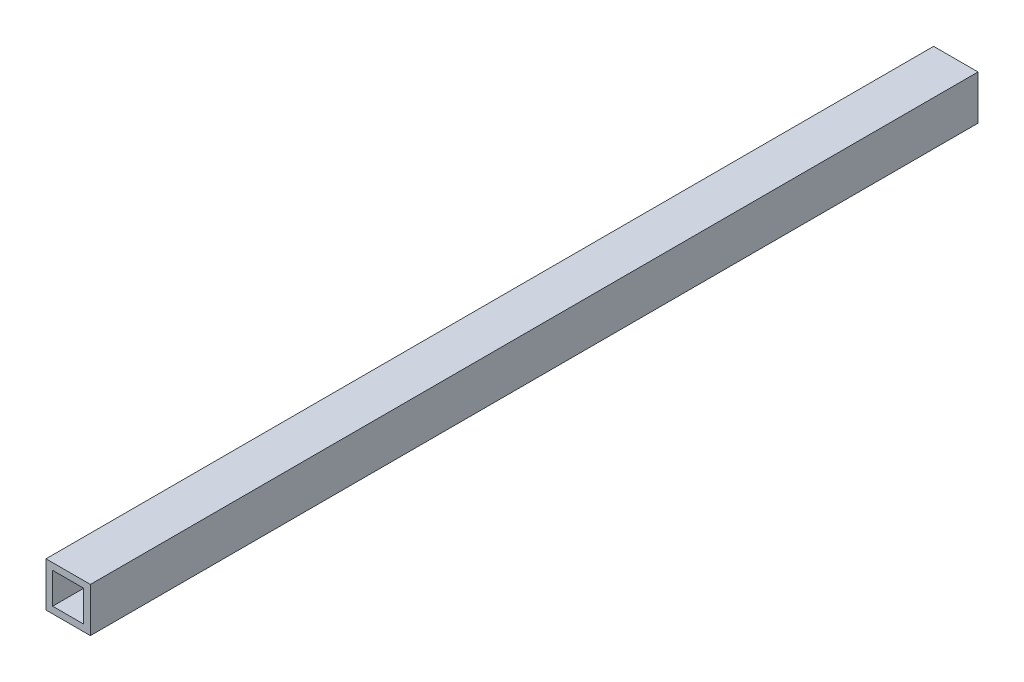
ISO-10303-21;
HEADER;
FILE_DESCRIPTION(('STEP AP214'),'2;1');
FILE_NAME('part.step','',(''),(''),'','','');
FILE_SCHEMA(('AUTOMOTIVE_DESIGN { 1 0 10303 214 1 1 1 1 }'));
ENDSEC;
DATA;
#1=APPLICATION_CONTEXT('core data for automotive mechanical design processes');
#2=APPLICATION_PROTOCOL_DEFINITION('international standard','automotive_design',2000,#1);
#3=PRODUCT_CONTEXT('',#1,'mechanical');
#4=PRODUCT('Part','Part','',(#3));
#5=PRODUCT_RELATED_PRODUCT_CATEGORY('part','',(#4));
#6=PRODUCT_DEFINITION_FORMATION('','',#4);
#7=PRODUCT_DEFINITION_CONTEXT('part definition',#1,'design');
#8=PRODUCT_DEFINITION('design','',#6,#7);
#9=PRODUCT_DEFINITION_SHAPE('','',#8);
#10=(LENGTH_UNIT() NAMED_UNIT(*) SI_UNIT(.MILLI.,.METRE.));
#11=(NAMED_UNIT(*) PLANE_ANGLE_UNIT() SI_UNIT($,.RADIAN.));
#12=(NAMED_UNIT(*) SI_UNIT($,.STERADIAN.) SOLID_ANGLE_UNIT());
#13=UNCERTAINTY_MEASURE_WITH_UNIT(LENGTH_MEASURE(1.E-05),#10,'distance_accuracy_value','');
#14=(GEOMETRIC_REPRESENTATION_CONTEXT(3) GLOBAL_UNCERTAINTY_ASSIGNED_CONTEXT((#13)) GLOBAL_UNIT_ASSIGNED_CONTEXT((#10,
#11,#12)) REPRESENTATION_CONTEXT('',''));
#15=CARTESIAN_POINT('',(0.,0.,0.));
#16=DIRECTION('',(0.,0.,1.));
#17=DIRECTION('',(1.,0.,0.));
#18=AXIS2_PLACEMENT_3D('',#15,#16,#17);
#19=CARTESIAN_POINT('',(0.,0.,200.));
#20=DIRECTION('',(0.,0.,1.));
#21=DIRECTION('',(1.,0.,0.));
#22=AXIS2_PLACEMENT_3D('',#19,#20,#21);
#23=PLANE('',#22);
#24=DIRECTION('',(0.,1.,0.));
#25=VECTOR('',#24,1.);
#26=CARTESIAN_POINT('',(5.,5.,200.));
#27=LINE('',#26,#25);
#28=CARTESIAN_POINT('',(5.,-5.,200.));
#29=VERTEX_POINT('',#28);
#30=CARTESIAN_POINT('',(5.,5.,200.));
#31=VERTEX_POINT('',#30);
#32=EDGE_CURVE('E136',#29,#31,#27,.T.);
#33=ORIENTED_EDGE('',*,*,#32,.T.);
#34=DIRECTION('',(-1.,0.,0.));
#35=VECTOR('',#34,1.);
#36=CARTESIAN_POINT('',(-5.,5.,200.));
#37=LINE('',#36,#35);
#38=CARTESIAN_POINT('',(-5.,5.,200.));
#39=VERTEX_POINT('',#38);
#40=EDGE_CURVE('E139',#31,#39,#37,.T.);
#41=ORIENTED_EDGE('',*,*,#40,.T.);
#42=DIRECTION('',(0.,-1.,0.));
#43=VECTOR('',#42,1.);
#44=CARTESIAN_POINT('',(-5.,5.,200.));
#45=LINE('',#44,#43);
#46=CARTESIAN_POINT('',(-5.,-5.,200.));
#47=VERTEX_POINT('',#46);
#48=EDGE_CURVE('E142',#39,#47,#45,.T.);
#49=ORIENTED_EDGE('',*,*,#48,.T.);
#50=DIRECTION('',(1.,0.,0.));
#51=VECTOR('',#50,1.);
#52=CARTESIAN_POINT('',(-5.,-5.,200.));
#53=LINE('',#52,#51);
#54=EDGE_CURVE('E144',#47,#29,#53,.T.);
#55=ORIENTED_EDGE('',*,*,#54,.T.);
#56=EDGE_LOOP('',(#33,#41,#49,#55));
#57=FACE_BOUND('',#56,.T.);
#58=DIRECTION('',(-1.,0.,0.));
#59=VECTOR('',#58,1.);
#60=CARTESIAN_POINT('',(-3.5,3.5,200.));
#61=LINE('',#60,#59);
#62=CARTESIAN_POINT('',(3.5,3.5,200.));
#63=VERTEX_POINT('',#62);
#64=CARTESIAN_POINT('',(-3.5,3.5,200.));
#65=VERTEX_POINT('',#64);
#66=EDGE_CURVE('E108',#63,#65,#61,.T.);
#67=ORIENTED_EDGE('',*,*,#66,.F.);
#68=DIRECTION('',(0.,1.,0.));
#69=VECTOR('',#68,1.);
#70=CARTESIAN_POINT('',(3.5,3.5,200.));
#71=LINE('',#70,#69);
#72=CARTESIAN_POINT('',(3.5,-3.5,200.));
#73=VERTEX_POINT('',#72);
#74=EDGE_CURVE('E100',#73,#63,#71,.T.);
#75=ORIENTED_EDGE('',*,*,#74,.F.);
#76=DIRECTION('',(1.,0.,0.));
#77=VECTOR('',#76,1.);
#78=CARTESIAN_POINT('',(-3.5,-3.5,200.));
#79=LINE('',#78,#77);
#80=CARTESIAN_POINT('',(-3.5,-3.5,200.));
#81=VERTEX_POINT('',#80);
#82=EDGE_CURVE('E122',#81,#73,#79,.T.);
#83=ORIENTED_EDGE('',*,*,#82,.F.);
#84=DIRECTION('',(0.,-1.,0.));
#85=VECTOR('',#84,1.);
#86=CARTESIAN_POINT('',(-3.5,3.5,200.));
#87=LINE('',#86,#85);
#88=EDGE_CURVE('E120',#65,#81,#87,.T.);
#89=ORIENTED_EDGE('',*,*,#88,.F.);
#90=EDGE_LOOP('',(#67,#75,#83,#89));
#91=FACE_BOUND('',#90,.T.);
#92=ADVANCED_FACE('F35',(#57,#91),#23,.T.);
#93=CARTESIAN_POINT('',(0.,0.,0.));
#94=DIRECTION('',(0.,0.,1.));
#95=DIRECTION('',(1.,0.,0.));
#96=AXIS2_PLACEMENT_3D('',#93,#94,#95);
#97=PLANE('',#96);
#98=DIRECTION('',(0.,1.,0.));
#99=VECTOR('',#98,1.);
#100=CARTESIAN_POINT('',(5.,5.,0.));
#101=LINE('',#100,#99);
#102=CARTESIAN_POINT('',(5.,-5.,0.));
#103=VERTEX_POINT('',#102);
#104=CARTESIAN_POINT('',(5.,5.,0.));
#105=VERTEX_POINT('',#104);
#106=EDGE_CURVE('E116',#103,#105,#101,.T.);
#107=ORIENTED_EDGE('',*,*,#106,.F.);
#108=DIRECTION('',(1.,0.,0.));
#109=VECTOR('',#108,1.);
#110=CARTESIAN_POINT('',(-5.,-5.,0.));
#111=LINE('',#110,#109);
#112=CARTESIAN_POINT('',(-5.,-5.,0.));
#113=VERTEX_POINT('',#112);
#114=EDGE_CURVE('E140',#113,#103,#111,.T.);
#115=ORIENTED_EDGE('',*,*,#114,.F.);
#116=DIRECTION('',(0.,-1.,0.));
#117=VECTOR('',#116,1.);
#118=CARTESIAN_POINT('',(-5.,5.,0.));
#119=LINE('',#118,#117);
#120=CARTESIAN_POINT('',(-5.,5.,0.));
#121=VERTEX_POINT('',#120);
#122=EDGE_CURVE('E151',#121,#113,#119,.T.);
#123=ORIENTED_EDGE('',*,*,#122,.F.);
#124=DIRECTION('',(-1.,0.,0.));
#125=VECTOR('',#124,1.);
#126=CARTESIAN_POINT('',(-5.,5.,0.));
#127=LINE('',#126,#125);
#128=EDGE_CURVE('E149',#105,#121,#127,.T.);
#129=ORIENTED_EDGE('',*,*,#128,.F.);
#130=EDGE_LOOP('',(#107,#115,#123,#129));
#131=FACE_BOUND('',#130,.T.);
#132=DIRECTION('',(0.,1.,0.));
#133=VECTOR('',#132,1.);
#134=CARTESIAN_POINT('',(3.5,3.5,0.));
#135=LINE('',#134,#133);
#136=CARTESIAN_POINT('',(3.5,-3.5,0.));
#137=VERTEX_POINT('',#136);
#138=CARTESIAN_POINT('',(3.5,3.5,0.));
#139=VERTEX_POINT('',#138);
#140=EDGE_CURVE('E58',#137,#139,#135,.T.);
#141=ORIENTED_EDGE('',*,*,#140,.T.);
#142=DIRECTION('',(-1.,0.,0.));
#143=VECTOR('',#142,1.);
#144=CARTESIAN_POINT('',(-3.5,3.5,0.));
#145=LINE('',#144,#143);
#146=CARTESIAN_POINT('',(-3.5,3.5,0.));
#147=VERTEX_POINT('',#146);
#148=EDGE_CURVE('E115',#139,#147,#145,.T.);
#149=ORIENTED_EDGE('',*,*,#148,.T.);
#150=DIRECTION('',(0.,-1.,0.));
#151=VECTOR('',#150,1.);
#152=CARTESIAN_POINT('',(-3.5,3.5,0.));
#153=LINE('',#152,#151);
#154=CARTESIAN_POINT('',(-3.5,-3.5,0.));
#155=VERTEX_POINT('',#154);
#156=EDGE_CURVE('E128',#147,#155,#153,.T.);
#157=ORIENTED_EDGE('',*,*,#156,.T.);
#158=DIRECTION('',(1.,0.,0.));
#159=VECTOR('',#158,1.);
#160=CARTESIAN_POINT('',(-3.5,-3.5,0.));
#161=LINE('',#160,#159);
#162=EDGE_CURVE('E109',#155,#137,#161,.T.);
#163=ORIENTED_EDGE('',*,*,#162,.T.);
#164=EDGE_LOOP('',(#141,#149,#157,#163));
#165=FACE_BOUND('',#164,.T.);
#166=ADVANCED_FACE('F169',(#131,#165),#97,.F.);
#167=CARTESIAN_POINT('',(5.,5.,200.));
#168=DIRECTION('',(-1.,0.,0.));
#169=DIRECTION('',(0.,0.,1.));
#170=AXIS2_PLACEMENT_3D('',#167,#168,#169);
#171=PLANE('',#170);
#172=ORIENTED_EDGE('',*,*,#106,.T.);
#173=DIRECTION('',(0.,0.,-1.));
#174=VECTOR('',#173,1.);
#175=CARTESIAN_POINT('',(5.,5.,200.));
#176=LINE('',#175,#174);
#177=EDGE_CURVE('E11',#31,#105,#176,.T.);
#178=ORIENTED_EDGE('',*,*,#177,.F.);
#179=ORIENTED_EDGE('',*,*,#32,.F.);
#180=DIRECTION('',(0.,0.,-1.));
#181=VECTOR('',#180,1.);
#182=CARTESIAN_POINT('',(5.,-5.,200.));
#183=LINE('',#182,#181);
#184=EDGE_CURVE('E146',#29,#103,#183,.T.);
#185=ORIENTED_EDGE('',*,*,#184,.T.);
#186=EDGE_LOOP('',(#172,#178,#179,#185));
#187=FACE_BOUND('',#186,.T.);
#188=ADVANCED_FACE('F37',(#187),#171,.F.);
#189=CARTESIAN_POINT('',(-5.,5.,200.));
#190=DIRECTION('',(0.,-1.,0.));
#191=DIRECTION('',(0.,0.,-1.));
#192=AXIS2_PLACEMENT_3D('',#189,#190,#191);
#193=PLANE('',#192);
#194=ORIENTED_EDGE('',*,*,#128,.T.);
#195=DIRECTION('',(0.,0.,-1.));
#196=VECTOR('',#195,1.);
#197=CARTESIAN_POINT('',(-5.,5.,200.));
#198=LINE('',#197,#196);
#199=EDGE_CURVE('E43',#39,#121,#198,.T.);
#200=ORIENTED_EDGE('',*,*,#199,.F.);
#201=ORIENTED_EDGE('',*,*,#40,.F.);
#202=ORIENTED_EDGE('',*,*,#177,.T.);
#203=EDGE_LOOP('',(#194,#200,#201,#202));
#204=FACE_BOUND('',#203,.T.);
#205=ADVANCED_FACE('F179',(#204),#193,.F.);
#206=CARTESIAN_POINT('',(-5.,5.,200.));
#207=DIRECTION('',(1.,0.,0.));
#208=DIRECTION('',(0.,0.,-1.));
#209=AXIS2_PLACEMENT_3D('',#206,#207,#208);
#210=PLANE('',#209);
#211=ORIENTED_EDGE('',*,*,#122,.T.);
#212=DIRECTION('',(0.,0.,-1.));
#213=VECTOR('',#212,1.);
#214=CARTESIAN_POINT('',(-5.,-5.,200.));
#215=LINE('',#214,#213);
#216=EDGE_CURVE('E156',#47,#113,#215,.T.);
#217=ORIENTED_EDGE('',*,*,#216,.F.);
#218=ORIENTED_EDGE('',*,*,#48,.F.);
#219=ORIENTED_EDGE('',*,*,#199,.T.);
#220=EDGE_LOOP('',(#211,#217,#218,#219));
#221=FACE_BOUND('',#220,.T.);
#222=ADVANCED_FACE('F163',(#221),#210,.F.);
#223=CARTESIAN_POINT('',(-5.,-5.,200.));
#224=DIRECTION('',(0.,1.,0.));
#225=DIRECTION('',(0.,0.,1.));
#226=AXIS2_PLACEMENT_3D('',#223,#224,#225);
#227=PLANE('',#226);
#228=ORIENTED_EDGE('',*,*,#114,.T.);
#229=ORIENTED_EDGE('',*,*,#184,.F.);
#230=ORIENTED_EDGE('',*,*,#54,.F.);
#231=ORIENTED_EDGE('',*,*,#216,.T.);
#232=EDGE_LOOP('',(#228,#229,#230,#231));
#233=FACE_BOUND('',#232,.T.);
#234=ADVANCED_FACE('F173',(#233),#227,.F.);
#235=CARTESIAN_POINT('',(3.5,3.5,200.));
#236=DIRECTION('',(-1.,0.,0.));
#237=DIRECTION('',(0.,0.,1.));
#238=AXIS2_PLACEMENT_3D('',#235,#236,#237);
#239=PLANE('',#238);
#240=ORIENTED_EDGE('',*,*,#140,.F.);
#241=DIRECTION('',(0.,0.,-1.));
#242=VECTOR('',#241,1.);
#243=CARTESIAN_POINT('',(3.5,-3.5,200.));
#244=LINE('',#243,#242);
#245=EDGE_CURVE('E104',#73,#137,#244,.T.);
#246=ORIENTED_EDGE('',*,*,#245,.F.);
#247=ORIENTED_EDGE('',*,*,#74,.T.);
#248=DIRECTION('',(0.,0.,-1.));
#249=VECTOR('',#248,1.);
#250=CARTESIAN_POINT('',(3.5,3.5,200.));
#251=LINE('',#250,#249);
#252=EDGE_CURVE('E103',#63,#139,#251,.T.);
#253=ORIENTED_EDGE('',*,*,#252,.T.);
#254=EDGE_LOOP('',(#240,#246,#247,#253));
#255=FACE_BOUND('',#254,.T.);
#256=ADVANCED_FACE('F102',(#255),#239,.T.);
#257=CARTESIAN_POINT('',(-3.5,3.5,200.));
#258=DIRECTION('',(0.,-1.,0.));
#259=DIRECTION('',(0.,0.,-1.));
#260=AXIS2_PLACEMENT_3D('',#257,#258,#259);
#261=PLANE('',#260);
#262=ORIENTED_EDGE('',*,*,#148,.F.);
#263=ORIENTED_EDGE('',*,*,#252,.F.);
#264=ORIENTED_EDGE('',*,*,#66,.T.);
#265=DIRECTION('',(0.,0.,-1.));
#266=VECTOR('',#265,1.);
#267=CARTESIAN_POINT('',(-3.5,3.5,200.));
#268=LINE('',#267,#266);
#269=EDGE_CURVE('E117',#65,#147,#268,.T.);
#270=ORIENTED_EDGE('',*,*,#269,.T.);
#271=EDGE_LOOP('',(#262,#263,#264,#270));
#272=FACE_BOUND('',#271,.T.);
#273=ADVANCED_FACE('F112',(#272),#261,.T.);
#274=CARTESIAN_POINT('',(-3.5,3.5,200.));
#275=DIRECTION('',(1.,0.,0.));
#276=DIRECTION('',(0.,0.,-1.));
#277=AXIS2_PLACEMENT_3D('',#274,#275,#276);
#278=PLANE('',#277);
#279=ORIENTED_EDGE('',*,*,#156,.F.);
#280=ORIENTED_EDGE('',*,*,#269,.F.);
#281=ORIENTED_EDGE('',*,*,#88,.T.);
#282=DIRECTION('',(0.,0.,-1.));
#283=VECTOR('',#282,1.);
#284=CARTESIAN_POINT('',(-3.5,-3.5,200.));
#285=LINE('',#284,#283);
#286=EDGE_CURVE('E50',#81,#155,#285,.T.);
#287=ORIENTED_EDGE('',*,*,#286,.T.);
#288=EDGE_LOOP('',(#279,#280,#281,#287));
#289=FACE_BOUND('',#288,.T.);
#290=ADVANCED_FACE('F202',(#289),#278,.T.);
#291=CARTESIAN_POINT('',(-3.5,-3.5,200.));
#292=DIRECTION('',(0.,1.,0.));
#293=DIRECTION('',(0.,0.,1.));
#294=AXIS2_PLACEMENT_3D('',#291,#292,#293);
#295=PLANE('',#294);
#296=ORIENTED_EDGE('',*,*,#162,.F.);
#297=ORIENTED_EDGE('',*,*,#286,.F.);
#298=ORIENTED_EDGE('',*,*,#82,.T.);
#299=ORIENTED_EDGE('',*,*,#245,.T.);
#300=EDGE_LOOP('',(#296,#297,#298,#299));
#301=FACE_BOUND('',#300,.T.);
#302=ADVANCED_FACE('F206',(#301),#295,.T.);
#303=CLOSED_SHELL('',(#92,#166,#188,#205,#222,#234,#256,#273,#290,#302));
#304=MANIFOLD_SOLID_BREP('B2',#303);
#305=ADVANCED_BREP_SHAPE_REPRESENTATION('',(#18,#304),#14);
#306=SHAPE_DEFINITION_REPRESENTATION(#9,#305);
ENDSEC;
END-ISO-10303-21;
